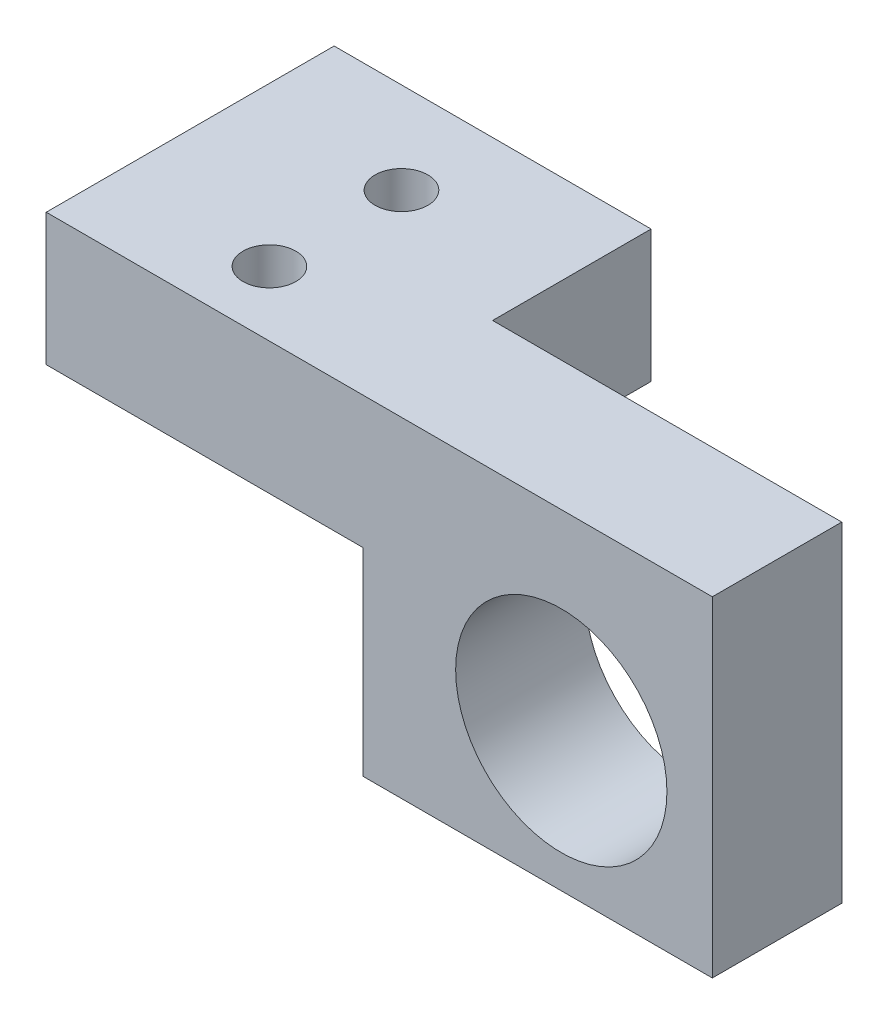
ISO-10303-21;
HEADER;
FILE_DESCRIPTION(('STEP AP214'),'2;1');
FILE_NAME('part.step','',(''),(''),'','','');
FILE_SCHEMA(('AUTOMOTIVE_DESIGN { 1 0 10303 214 1 1 1 1 }'));
ENDSEC;
DATA;
#1=APPLICATION_CONTEXT('core data for automotive mechanical design processes');
#2=APPLICATION_PROTOCOL_DEFINITION('international standard','automotive_design',2000,#1);
#3=PRODUCT_CONTEXT('',#1,'mechanical');
#4=PRODUCT('Part','Part','',(#3));
#5=PRODUCT_RELATED_PRODUCT_CATEGORY('part','',(#4));
#6=PRODUCT_DEFINITION_FORMATION('','',#4);
#7=PRODUCT_DEFINITION_CONTEXT('part definition',#1,'design');
#8=PRODUCT_DEFINITION('design','',#6,#7);
#9=PRODUCT_DEFINITION_SHAPE('','',#8);
#10=(LENGTH_UNIT() NAMED_UNIT(*) SI_UNIT(.MILLI.,.METRE.));
#11=(NAMED_UNIT(*) PLANE_ANGLE_UNIT() SI_UNIT($,.RADIAN.));
#12=(NAMED_UNIT(*) SI_UNIT($,.STERADIAN.) SOLID_ANGLE_UNIT());
#13=UNCERTAINTY_MEASURE_WITH_UNIT(LENGTH_MEASURE(1.E-05),#10,'distance_accuracy_value','');
#14=(GEOMETRIC_REPRESENTATION_CONTEXT(3) GLOBAL_UNCERTAINTY_ASSIGNED_CONTEXT((#13)) GLOBAL_UNIT_ASSIGNED_CONTEXT((#10,
#11,#12)) REPRESENTATION_CONTEXT('',''));
#15=CARTESIAN_POINT('',(0.,0.,0.));
#16=DIRECTION('',(0.,0.,1.));
#17=DIRECTION('',(1.,0.,0.));
#18=AXIS2_PLACEMENT_3D('',#15,#16,#17);
#19=CARTESIAN_POINT('',(0.,0.,0.));
#20=DIRECTION('',(0.,0.,1.));
#21=DIRECTION('',(1.,0.,0.));
#22=AXIS2_PLACEMENT_3D('',#19,#20,#21);
#23=PLANE('',#22);
#24=CARTESIAN_POINT('',(15.0000000000003,10.5,0.));
#25=DIRECTION('',(0.,0.,1.00000000000002));
#26=DIRECTION('',(1.00000000000002,0.,0.));
#27=AXIS2_PLACEMENT_3D('',#24,#25,#26);
#28=CIRCLE('',#27,8.);
#29=CARTESIAN_POINT('',(23.0000000000005,10.5,0.));
#30=VERTEX_POINT('',#29);
#31=EDGE_CURVE('E151',#30,#30,#28,.T.);
#32=ORIENTED_EDGE('',*,*,#31,.T.);
#33=EDGE_LOOP('',(#32));
#34=FACE_BOUND('',#33,.T.);
#35=DIRECTION('',(0.,-1.,0.));
#36=VECTOR('',#35,1.);
#37=CARTESIAN_POINT('',(0.,15.,0.));
#38=LINE('',#37,#36);
#39=CARTESIAN_POINT('',(0.,25.0000000000002,0.));
#40=VERTEX_POINT('',#39);
#41=CARTESIAN_POINT('',(0.,15.,0.));
#42=VERTEX_POINT('',#41);
#43=EDGE_CURVE('E124',#40,#42,#38,.T.);
#44=ORIENTED_EDGE('',*,*,#43,.F.);
#45=DIRECTION('',(1.,0.,0.));
#46=VECTOR('',#45,1.);
#47=CARTESIAN_POINT('',(0.,25.0000000000002,0.));
#48=LINE('',#47,#46);
#49=CARTESIAN_POINT('',(26.438013120329,25.0000000000002,0.));
#50=VERTEX_POINT('',#49);
#51=EDGE_CURVE('E207',#40,#50,#48,.T.);
#52=ORIENTED_EDGE('',*,*,#51,.T.);
#53=DIRECTION('',(0.,-1.,0.));
#54=VECTOR('',#53,1.);
#55=CARTESIAN_POINT('',(26.438013120329,0.,0.));
#56=LINE('',#55,#54);
#57=CARTESIAN_POINT('',(26.438013120329,0.,0.));
#58=VERTEX_POINT('',#57);
#59=EDGE_CURVE('E131',#50,#58,#56,.T.);
#60=ORIENTED_EDGE('',*,*,#59,.T.);
#61=DIRECTION('',(1.,0.,0.));
#62=VECTOR('',#61,1.);
#63=CARTESIAN_POINT('',(0.,0.,0.));
#64=LINE('',#63,#62);
#65=CARTESIAN_POINT('',(0.,0.,0.));
#66=VERTEX_POINT('',#65);
#67=EDGE_CURVE('E56',#66,#58,#64,.T.);
#68=ORIENTED_EDGE('',*,*,#67,.F.);
#69=DIRECTION('',(0.,-1.,0.));
#70=VECTOR('',#69,1.);
#71=CARTESIAN_POINT('',(0.,0.,0.));
#72=LINE('',#71,#70);
#73=EDGE_CURVE('E147',#42,#66,#72,.T.);
#74=ORIENTED_EDGE('',*,*,#73,.F.);
#75=EDGE_LOOP('',(#44,#52,#60,#68,#74));
#76=FACE_BOUND('',#75,.T.);
#77=ADVANCED_FACE('F34',(#34,#76),#23,.F.);
#78=CARTESIAN_POINT('',(0.,0.,4.8));
#79=DIRECTION('',(1.,0.,0.));
#80=DIRECTION('',(0.,1.,0.));
#81=AXIS2_PLACEMENT_3D('',#78,#79,#80);
#82=PLANE('',#81);
#83=ORIENTED_EDGE('',*,*,#73,.T.);
#84=DIRECTION('',(0.,0.,-1.));
#85=VECTOR('',#84,1.);
#86=CARTESIAN_POINT('',(0.,0.,4.8));
#87=LINE('',#86,#85);
#88=CARTESIAN_POINT('',(0.,0.,9.8));
#89=VERTEX_POINT('',#88);
#90=EDGE_CURVE('E42',#89,#66,#87,.T.);
#91=ORIENTED_EDGE('',*,*,#90,.F.);
#92=DIRECTION('',(0.,-1.,0.));
#93=VECTOR('',#92,1.);
#94=CARTESIAN_POINT('',(0.,0.,9.8));
#95=LINE('',#94,#93);
#96=CARTESIAN_POINT('',(0.,15.,9.8));
#97=VERTEX_POINT('',#96);
#98=EDGE_CURVE('E137',#97,#89,#95,.T.);
#99=ORIENTED_EDGE('',*,*,#98,.F.);
#100=DIRECTION('',(0.,0.,-1.));
#101=VECTOR('',#100,1.);
#102=CARTESIAN_POINT('',(0.,15.,4.8));
#103=LINE('',#102,#101);
#104=EDGE_CURVE('E154',#97,#42,#103,.T.);
#105=ORIENTED_EDGE('',*,*,#104,.T.);
#106=EDGE_LOOP('',(#83,#91,#99,#105));
#107=FACE_BOUND('',#106,.T.);
#108=ADVANCED_FACE('F36',(#107),#82,.F.);
#109=CARTESIAN_POINT('',(0.,0.,4.8));
#110=DIRECTION('',(0.,1.,0.));
#111=DIRECTION('',(-1.,0.,0.));
#112=AXIS2_PLACEMENT_3D('',#109,#110,#111);
#113=PLANE('',#112);
#114=ORIENTED_EDGE('',*,*,#67,.T.);
#115=DIRECTION('',(0.,0.,1.));
#116=VECTOR('',#115,1.);
#117=CARTESIAN_POINT('',(26.438013120329,0.,-90.2));
#118=LINE('',#117,#116);
#119=CARTESIAN_POINT('',(26.438013120329,0.,9.8));
#120=VERTEX_POINT('',#119);
#121=EDGE_CURVE('E128',#58,#120,#118,.T.);
#122=ORIENTED_EDGE('',*,*,#121,.T.);
#123=DIRECTION('',(1.00000000000001,0.,0.));
#124=VECTOR('',#123,1.);
#125=CARTESIAN_POINT('',(0.,0.,9.8));
#126=LINE('',#125,#124);
#127=EDGE_CURVE('E140',#89,#120,#126,.T.);
#128=ORIENTED_EDGE('',*,*,#127,.F.);
#129=ORIENTED_EDGE('',*,*,#90,.T.);
#130=EDGE_LOOP('',(#114,#122,#128,#129));
#131=FACE_BOUND('',#130,.T.);
#132=ADVANCED_FACE('F188',(#131),#113,.F.);
#133=CARTESIAN_POINT('',(-23.9999999999999,0.,4.8));
#134=DIRECTION('',(1.,0.,0.));
#135=DIRECTION('',(0.,1.,0.));
#136=AXIS2_PLACEMENT_3D('',#133,#134,#135);
#137=PLANE('',#136);
#138=DIRECTION('',(0.,-1.,0.));
#139=VECTOR('',#138,1.);
#140=CARTESIAN_POINT('',(-23.9999999999999,0.,9.8));
#141=LINE('',#140,#139);
#142=CARTESIAN_POINT('',(-24.,25.0000000000001,9.8));
#143=VERTEX_POINT('',#142);
#144=CARTESIAN_POINT('',(-24.,15.,9.8));
#145=VERTEX_POINT('',#144);
#146=EDGE_CURVE('E107',#143,#145,#141,.T.);
#147=ORIENTED_EDGE('',*,*,#146,.F.);
#148=DIRECTION('',(0.,0.,1.));
#149=VECTOR('',#148,1.);
#150=CARTESIAN_POINT('',(-24.,25.0000000000001,-12.));
#151=LINE('',#150,#149);
#152=CARTESIAN_POINT('',(-24.,25.0000000000001,-12.));
#153=VERTEX_POINT('',#152);
#154=EDGE_CURVE('E96',#153,#143,#151,.T.);
#155=ORIENTED_EDGE('',*,*,#154,.F.);
#156=DIRECTION('',(0.,1.,0.));
#157=VECTOR('',#156,1.);
#158=CARTESIAN_POINT('',(-24.,15.,-12.));
#159=LINE('',#158,#157);
#160=CARTESIAN_POINT('',(-24.,15.,-12.));
#161=VERTEX_POINT('',#160);
#162=EDGE_CURVE('E106',#161,#153,#159,.T.);
#163=ORIENTED_EDGE('',*,*,#162,.F.);
#164=DIRECTION('',(0.,0.,-1.));
#165=VECTOR('',#164,1.);
#166=CARTESIAN_POINT('',(-23.9999999999999,15.,4.8));
#167=LINE('',#166,#165);
#168=EDGE_CURVE('E157',#145,#161,#167,.T.);
#169=ORIENTED_EDGE('',*,*,#168,.F.);
#170=EDGE_LOOP('',(#147,#155,#163,#169));
#171=FACE_BOUND('',#170,.T.);
#172=ADVANCED_FACE('F104',(#171),#137,.F.);
#173=CARTESIAN_POINT('',(0.,15.,4.8));
#174=DIRECTION('',(0.,1.,0.));
#175=DIRECTION('',(-1.,0.,0.));
#176=AXIS2_PLACEMENT_3D('',#173,#174,#175);
#177=PLANE('',#176);
#178=CARTESIAN_POINT('',(-11.9999999999999,15.,-5.1));
#179=DIRECTION('',(0.,1.,0.));
#180=DIRECTION('',(-1.,0.,0.));
#181=AXIS2_PLACEMENT_3D('',#178,#179,#180);
#182=CIRCLE('',#181,2.);
#183=CARTESIAN_POINT('',(-13.9999999999999,15.,-5.1));
#184=VERTEX_POINT('',#183);
#185=EDGE_CURVE('E109',#184,#184,#182,.T.);
#186=ORIENTED_EDGE('',*,*,#185,.T.);
#187=EDGE_LOOP('',(#186));
#188=FACE_BOUND('',#187,.T.);
#189=CARTESIAN_POINT('',(-12.,15.,4.9));
#190=DIRECTION('',(0.,1.,0.));
#191=DIRECTION('',(-1.,0.,0.));
#192=AXIS2_PLACEMENT_3D('',#189,#190,#191);
#193=CIRCLE('',#192,2.);
#194=CARTESIAN_POINT('',(-14.,15.,4.9));
#195=VERTEX_POINT('',#194);
#196=EDGE_CURVE('E133',#195,#195,#193,.T.);
#197=ORIENTED_EDGE('',*,*,#196,.T.);
#198=EDGE_LOOP('',(#197));
#199=FACE_BOUND('',#198,.T.);
#200=ORIENTED_EDGE('',*,*,#168,.T.);
#201=DIRECTION('',(-1.,0.,0.));
#202=VECTOR('',#201,1.);
#203=CARTESIAN_POINT('',(0.,15.,-12.));
#204=LINE('',#203,#202);
#205=CARTESIAN_POINT('',(0.,15.,-12.));
#206=VERTEX_POINT('',#205);
#207=EDGE_CURVE('E114',#206,#161,#204,.T.);
#208=ORIENTED_EDGE('',*,*,#207,.F.);
#209=DIRECTION('',(0.,0.,1.));
#210=VECTOR('',#209,1.);
#211=CARTESIAN_POINT('',(0.,15.,-12.));
#212=LINE('',#211,#210);
#213=EDGE_CURVE('E115',#206,#42,#212,.T.);
#214=ORIENTED_EDGE('',*,*,#213,.T.);
#215=ORIENTED_EDGE('',*,*,#104,.F.);
#216=DIRECTION('',(1.,0.,0.));
#217=VECTOR('',#216,1.);
#218=CARTESIAN_POINT('',(0.,15.,9.8));
#219=LINE('',#218,#217);
#220=EDGE_CURVE('E134',#145,#97,#219,.T.);
#221=ORIENTED_EDGE('',*,*,#220,.F.);
#222=EDGE_LOOP('',(#200,#208,#214,#215,#221));
#223=FACE_BOUND('',#222,.T.);
#224=ADVANCED_FACE('F162',(#188,#199,#223),#177,.F.);
#225=CARTESIAN_POINT('',(15.0000000000003,10.5,4.8));
#226=DIRECTION('',(0.,0.,-1.));
#227=DIRECTION('',(-1.,0.,0.));
#228=AXIS2_PLACEMENT_3D('',#225,#226,#227);
#229=CYLINDRICAL_SURFACE('',#228,8.);
#230=ORIENTED_EDGE('',*,*,#31,.F.);
#231=EDGE_LOOP('',(#230));
#232=FACE_BOUND('',#231,.T.);
#233=CARTESIAN_POINT('',(15.0000000000004,10.5,9.80000000000001));
#234=DIRECTION('',(0.,0.,1.00000000000001));
#235=DIRECTION('',(1.00000000000001,0.,0.));
#236=AXIS2_PLACEMENT_3D('',#233,#234,#235);
#237=CIRCLE('',#236,8.);
#238=CARTESIAN_POINT('',(23.0000000000005,10.5,9.80000000000001));
#239=VERTEX_POINT('',#238);
#240=EDGE_CURVE('E144',#239,#239,#237,.F.);
#241=ORIENTED_EDGE('',*,*,#240,.F.);
#242=EDGE_LOOP('',(#241));
#243=FACE_BOUND('',#242,.T.);
#244=ADVANCED_FACE('F178',(#232,#243),#229,.F.);
#245=CARTESIAN_POINT('',(0.,0.,9.8));
#246=DIRECTION('',(0.,0.,1.));
#247=DIRECTION('',(1.,0.,0.));
#248=AXIS2_PLACEMENT_3D('',#245,#246,#247);
#249=PLANE('',#248);
#250=DIRECTION('',(-1.,0.,0.));
#251=VECTOR('',#250,1.);
#252=CARTESIAN_POINT('',(176.,25.0000000000007,9.8));
#253=LINE('',#252,#251);
#254=CARTESIAN_POINT('',(26.438013120329,25.0000000000002,9.8));
#255=VERTEX_POINT('',#254);
#256=EDGE_CURVE('E108',#255,#143,#253,.T.);
#257=ORIENTED_EDGE('',*,*,#256,.T.);
#258=ORIENTED_EDGE('',*,*,#146,.T.);
#259=ORIENTED_EDGE('',*,*,#220,.T.);
#260=ORIENTED_EDGE('',*,*,#98,.T.);
#261=ORIENTED_EDGE('',*,*,#127,.T.);
#262=DIRECTION('',(0.,-1.,0.));
#263=VECTOR('',#262,1.);
#264=CARTESIAN_POINT('',(26.438013120329,0.,9.8));
#265=LINE('',#264,#263);
#266=EDGE_CURVE('E118',#255,#120,#265,.T.);
#267=ORIENTED_EDGE('',*,*,#266,.F.);
#268=EDGE_LOOP('',(#257,#258,#259,#260,#261,#267));
#269=FACE_BOUND('',#268,.T.);
#270=ORIENTED_EDGE('',*,*,#240,.T.);
#271=EDGE_LOOP('',(#270));
#272=FACE_BOUND('',#271,.T.);
#273=ADVANCED_FACE('F168',(#269,#272),#249,.T.);
#274=CARTESIAN_POINT('',(-12.0000000000001,0.,4.9));
#275=DIRECTION('',(0.,1.,0.));
#276=DIRECTION('',(-1.,0.,0.));
#277=AXIS2_PLACEMENT_3D('',#274,#275,#276);
#278=CYLINDRICAL_SURFACE('',#277,2.);
#279=CARTESIAN_POINT('',(-12.,25.0000000000001,4.9));
#280=DIRECTION('',(0.,-1.,0.));
#281=DIRECTION('',(1.,0.,0.));
#282=AXIS2_PLACEMENT_3D('',#279,#280,#281);
#283=CIRCLE('',#282,2.);
#284=CARTESIAN_POINT('',(-9.99999999999996,25.0000000000001,4.9));
#285=VERTEX_POINT('',#284);
#286=EDGE_CURVE('E125',#285,#285,#283,.F.);
#287=ORIENTED_EDGE('',*,*,#286,.T.);
#288=EDGE_LOOP('',(#287));
#289=FACE_BOUND('',#288,.T.);
#290=ORIENTED_EDGE('',*,*,#196,.F.);
#291=EDGE_LOOP('',(#290));
#292=FACE_BOUND('',#291,.T.);
#293=ADVANCED_FACE('F165',(#289,#292),#278,.F.);
#294=CARTESIAN_POINT('',(26.438013120329,0.,-90.2));
#295=DIRECTION('',(-1.,0.,0.));
#296=DIRECTION('',(0.,0.,1.));
#297=AXIS2_PLACEMENT_3D('',#294,#295,#296);
#298=PLANE('',#297);
#299=ORIENTED_EDGE('',*,*,#59,.F.);
#300=DIRECTION('',(0.,0.,1.));
#301=VECTOR('',#300,1.);
#302=CARTESIAN_POINT('',(26.438013120329,25.0000000000002,-90.2));
#303=LINE('',#302,#301);
#304=EDGE_CURVE('E212',#50,#255,#303,.T.);
#305=ORIENTED_EDGE('',*,*,#304,.T.);
#306=ORIENTED_EDGE('',*,*,#266,.T.);
#307=ORIENTED_EDGE('',*,*,#121,.F.);
#308=EDGE_LOOP('',(#299,#305,#306,#307));
#309=FACE_BOUND('',#308,.T.);
#310=ADVANCED_FACE('F167',(#309),#298,.F.);
#311=CARTESIAN_POINT('',(0.,15.,-12.));
#312=DIRECTION('',(-1.,0.,0.));
#313=DIRECTION('',(0.,0.,1.));
#314=AXIS2_PLACEMENT_3D('',#311,#312,#313);
#315=PLANE('',#314);
#316=DIRECTION('',(0.,-1.,0.));
#317=VECTOR('',#316,1.);
#318=CARTESIAN_POINT('',(0.,15.,-12.));
#319=LINE('',#318,#317);
#320=CARTESIAN_POINT('',(0.,25.0000000000001,-12.));
#321=VERTEX_POINT('',#320);
#322=EDGE_CURVE('E120',#321,#206,#319,.T.);
#323=ORIENTED_EDGE('',*,*,#322,.F.);
#324=DIRECTION('',(0.,0.,1.));
#325=VECTOR('',#324,1.);
#326=CARTESIAN_POINT('',(0.,25.0000000000002,-12.));
#327=LINE('',#326,#325);
#328=EDGE_CURVE('E49',#321,#40,#327,.T.);
#329=ORIENTED_EDGE('',*,*,#328,.T.);
#330=ORIENTED_EDGE('',*,*,#43,.T.);
#331=ORIENTED_EDGE('',*,*,#213,.F.);
#332=EDGE_LOOP('',(#323,#329,#330,#331));
#333=FACE_BOUND('',#332,.T.);
#334=ADVANCED_FACE('F175',(#333),#315,.F.);
#335=CARTESIAN_POINT('',(0.,0.,-12.));
#336=DIRECTION('',(0.,0.,1.));
#337=DIRECTION('',(0.,-1.,0.));
#338=AXIS2_PLACEMENT_3D('',#335,#336,#337);
#339=PLANE('',#338);
#340=ORIENTED_EDGE('',*,*,#162,.T.);
#341=DIRECTION('',(1.,0.,0.));
#342=VECTOR('',#341,1.);
#343=CARTESIAN_POINT('',(0.,25.0000000000002,-12.));
#344=LINE('',#343,#342);
#345=EDGE_CURVE('E11',#153,#321,#344,.T.);
#346=ORIENTED_EDGE('',*,*,#345,.T.);
#347=ORIENTED_EDGE('',*,*,#322,.T.);
#348=ORIENTED_EDGE('',*,*,#207,.T.);
#349=EDGE_LOOP('',(#340,#346,#347,#348));
#350=FACE_BOUND('',#349,.T.);
#351=ADVANCED_FACE('F112',(#350),#339,.F.);
#352=CARTESIAN_POINT('',(176.,25.0000000000007,-12.));
#353=DIRECTION('',(0.,-1.,0.));
#354=DIRECTION('',(1.,0.,0.));
#355=AXIS2_PLACEMENT_3D('',#352,#353,#354);
#356=PLANE('',#355);
#357=CARTESIAN_POINT('',(-12.,25.0000000000001,-5.1));
#358=DIRECTION('',(0.,1.,0.));
#359=DIRECTION('',(-1.,0.,0.));
#360=AXIS2_PLACEMENT_3D('',#357,#358,#359);
#361=CIRCLE('',#360,2.);
#362=CARTESIAN_POINT('',(-14.,25.0000000000001,-5.1));
#363=VERTEX_POINT('',#362);
#364=EDGE_CURVE('E360',#363,#363,#361,.T.);
#365=ORIENTED_EDGE('',*,*,#364,.F.);
#366=EDGE_LOOP('',(#365));
#367=FACE_BOUND('',#366,.T.);
#368=ORIENTED_EDGE('',*,*,#51,.F.);
#369=ORIENTED_EDGE('',*,*,#328,.F.);
#370=ORIENTED_EDGE('',*,*,#345,.F.);
#371=ORIENTED_EDGE('',*,*,#154,.T.);
#372=ORIENTED_EDGE('',*,*,#256,.F.);
#373=ORIENTED_EDGE('',*,*,#304,.F.);
#374=EDGE_LOOP('',(#368,#369,#370,#371,#372,#373));
#375=FACE_BOUND('',#374,.T.);
#376=ORIENTED_EDGE('',*,*,#286,.F.);
#377=EDGE_LOOP('',(#376));
#378=FACE_BOUND('',#377,.T.);
#379=ADVANCED_FACE('F94',(#367,#375,#378),#356,.F.);
#380=CARTESIAN_POINT('',(-11.9999999999994,-175.,-5.1));
#381=DIRECTION('',(0.,1.,0.));
#382=DIRECTION('',(-1.,0.,0.));
#383=AXIS2_PLACEMENT_3D('',#380,#381,#382);
#384=CYLINDRICAL_SURFACE('',#383,2.);
#385=ORIENTED_EDGE('',*,*,#364,.T.);
#386=EDGE_LOOP('',(#385));
#387=FACE_BOUND('',#386,.T.);
#388=ORIENTED_EDGE('',*,*,#185,.F.);
#389=EDGE_LOOP('',(#388));
#390=FACE_BOUND('',#389,.T.);
#391=ADVANCED_FACE('F225',(#387,#390),#384,.F.);
#392=CLOSED_SHELL('',(#77,#108,#132,#172,#224,#244,#273,#293,#310,#334,#351,#379,#391));
#393=MANIFOLD_SOLID_BREP('B2',#392);
#394=ADVANCED_BREP_SHAPE_REPRESENTATION('',(#18,#393),#14);
#395=SHAPE_DEFINITION_REPRESENTATION(#9,#394);
ENDSEC;
END-ISO-10303-21;
